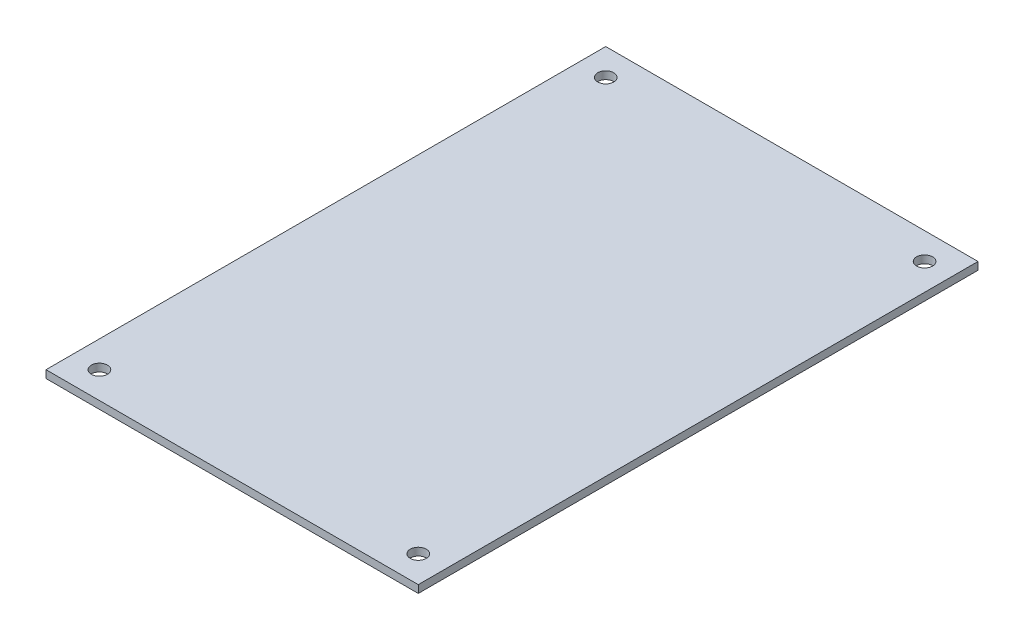
ISO-10303-21;
HEADER;
FILE_DESCRIPTION(('STEP AP214'),'2;1');
FILE_NAME('part.step','',(''),(''),'','','');
FILE_SCHEMA(('AUTOMOTIVE_DESIGN { 1 0 10303 214 1 1 1 1 }'));
ENDSEC;
DATA;
#1=APPLICATION_CONTEXT('core data for automotive mechanical design processes');
#2=APPLICATION_PROTOCOL_DEFINITION('international standard','automotive_design',2000,#1);
#3=PRODUCT_CONTEXT('',#1,'mechanical');
#4=PRODUCT('Part','Part','',(#3));
#5=PRODUCT_RELATED_PRODUCT_CATEGORY('part','',(#4));
#6=PRODUCT_DEFINITION_FORMATION('','',#4);
#7=PRODUCT_DEFINITION_CONTEXT('part definition',#1,'design');
#8=PRODUCT_DEFINITION('design','',#6,#7);
#9=PRODUCT_DEFINITION_SHAPE('','',#8);
#10=(LENGTH_UNIT() NAMED_UNIT(*) SI_UNIT(.MILLI.,.METRE.));
#11=(NAMED_UNIT(*) PLANE_ANGLE_UNIT() SI_UNIT($,.RADIAN.));
#12=(NAMED_UNIT(*) SI_UNIT($,.STERADIAN.) SOLID_ANGLE_UNIT());
#13=UNCERTAINTY_MEASURE_WITH_UNIT(LENGTH_MEASURE(1.E-05),#10,'distance_accuracy_value','');
#14=(GEOMETRIC_REPRESENTATION_CONTEXT(3) GLOBAL_UNCERTAINTY_ASSIGNED_CONTEXT((#13)) GLOBAL_UNIT_ASSIGNED_CONTEXT((#10,
#11,#12)) REPRESENTATION_CONTEXT('',''));
#15=CARTESIAN_POINT('',(0.,0.,0.));
#16=DIRECTION('',(0.,0.,1.));
#17=DIRECTION('',(1.,0.,0.));
#18=AXIS2_PLACEMENT_3D('',#15,#16,#17);
#19=CARTESIAN_POINT('',(-39.4716,1.6256,59.3471));
#20=DIRECTION('',(1.,0.,0.));
#21=DIRECTION('',(0.,0.,-1.));
#22=AXIS2_PLACEMENT_3D('',#19,#20,#21);
#23=PLANE('',#22);
#24=DIRECTION('',(0.,0.,1.));
#25=VECTOR('',#24,1.);
#26=CARTESIAN_POINT('',(-39.4716,0.,59.3471));
#27=LINE('',#26,#25);
#28=CARTESIAN_POINT('',(-39.4716,0.,-59.3471));
#29=VERTEX_POINT('',#28);
#30=CARTESIAN_POINT('',(-39.4716,0.,59.3471));
#31=VERTEX_POINT('',#30);
#32=EDGE_CURVE('E99',#29,#31,#27,.T.);
#33=ORIENTED_EDGE('',*,*,#32,.T.);
#34=DIRECTION('',(0.,-1.,0.));
#35=VECTOR('',#34,1.);
#36=CARTESIAN_POINT('',(-39.4716,1.6256,59.3471));
#37=LINE('',#36,#35);
#38=CARTESIAN_POINT('',(-39.4716,1.6256,59.3471));
#39=VERTEX_POINT('',#38);
#40=EDGE_CURVE('E11',#39,#31,#37,.T.);
#41=ORIENTED_EDGE('',*,*,#40,.F.);
#42=DIRECTION('',(0.,0.,1.));
#43=VECTOR('',#42,1.);
#44=CARTESIAN_POINT('',(-39.4716,1.6256,59.3471));
#45=LINE('',#44,#43);
#46=CARTESIAN_POINT('',(-39.4716,1.6256,-59.3471));
#47=VERTEX_POINT('',#46);
#48=EDGE_CURVE('E87',#47,#39,#45,.T.);
#49=ORIENTED_EDGE('',*,*,#48,.F.);
#50=DIRECTION('',(0.,-1.,0.));
#51=VECTOR('',#50,1.);
#52=CARTESIAN_POINT('',(-39.4716,1.6256,-59.3471));
#53=LINE('',#52,#51);
#54=EDGE_CURVE('E95',#47,#29,#53,.T.);
#55=ORIENTED_EDGE('',*,*,#54,.T.);
#56=EDGE_LOOP('',(#33,#41,#49,#55));
#57=FACE_BOUND('',#56,.T.);
#58=ADVANCED_FACE('F36',(#57),#23,.F.);
#59=CARTESIAN_POINT('',(39.4716,1.6256,59.3471));
#60=DIRECTION('',(0.,0.,-1.));
#61=DIRECTION('',(-1.,0.,0.));
#62=AXIS2_PLACEMENT_3D('',#59,#60,#61);
#63=PLANE('',#62);
#64=DIRECTION('',(1.,0.,0.));
#65=VECTOR('',#64,1.);
#66=CARTESIAN_POINT('',(39.4716,0.,59.3471));
#67=LINE('',#66,#65);
#68=CARTESIAN_POINT('',(39.4716,0.,59.3471));
#69=VERTEX_POINT('',#68);
#70=EDGE_CURVE('E91',#31,#69,#67,.T.);
#71=ORIENTED_EDGE('',*,*,#70,.T.);
#72=DIRECTION('',(0.,-1.,0.));
#73=VECTOR('',#72,1.);
#74=CARTESIAN_POINT('',(39.4716,1.6256,59.3471));
#75=LINE('',#74,#73);
#76=CARTESIAN_POINT('',(39.4716,1.6256,59.3471));
#77=VERTEX_POINT('',#76);
#78=EDGE_CURVE('E44',#77,#69,#75,.T.);
#79=ORIENTED_EDGE('',*,*,#78,.F.);
#80=DIRECTION('',(1.,0.,0.));
#81=VECTOR('',#80,1.);
#82=CARTESIAN_POINT('',(39.4716,1.6256,59.3471));
#83=LINE('',#82,#81);
#84=EDGE_CURVE('E82',#39,#77,#83,.T.);
#85=ORIENTED_EDGE('',*,*,#84,.F.);
#86=ORIENTED_EDGE('',*,*,#40,.T.);
#87=EDGE_LOOP('',(#71,#79,#85,#86));
#88=FACE_BOUND('',#87,.T.);
#89=ADVANCED_FACE('F90',(#88),#63,.F.);
#90=CARTESIAN_POINT('',(39.4716,1.6256,59.3471));
#91=DIRECTION('',(-1.,0.,0.));
#92=DIRECTION('',(0.,0.,1.));
#93=AXIS2_PLACEMENT_3D('',#90,#91,#92);
#94=PLANE('',#93);
#95=DIRECTION('',(0.,0.,-1.));
#96=VECTOR('',#95,1.);
#97=CARTESIAN_POINT('',(39.4716,0.,59.3471));
#98=LINE('',#97,#96);
#99=CARTESIAN_POINT('',(39.4716,0.,-59.3471));
#100=VERTEX_POINT('',#99);
#101=EDGE_CURVE('E69',#69,#100,#98,.T.);
#102=ORIENTED_EDGE('',*,*,#101,.T.);
#103=DIRECTION('',(0.,-1.,0.));
#104=VECTOR('',#103,1.);
#105=CARTESIAN_POINT('',(39.4716,1.6256,-59.3471));
#106=LINE('',#105,#104);
#107=CARTESIAN_POINT('',(39.4716,1.6256,-59.3471));
#108=VERTEX_POINT('',#107);
#109=EDGE_CURVE('E92',#108,#100,#106,.T.);
#110=ORIENTED_EDGE('',*,*,#109,.F.);
#111=DIRECTION('',(0.,0.,-1.));
#112=VECTOR('',#111,1.);
#113=CARTESIAN_POINT('',(39.4716,1.6256,59.3471));
#114=LINE('',#113,#112);
#115=EDGE_CURVE('E85',#77,#108,#114,.T.);
#116=ORIENTED_EDGE('',*,*,#115,.F.);
#117=ORIENTED_EDGE('',*,*,#78,.T.);
#118=EDGE_LOOP('',(#102,#110,#116,#117));
#119=FACE_BOUND('',#118,.T.);
#120=ADVANCED_FACE('F93',(#119),#94,.F.);
#121=CARTESIAN_POINT('',(39.4716,1.6256,-59.3471));
#122=DIRECTION('',(0.,0.,1.));
#123=DIRECTION('',(1.,0.,0.));
#124=AXIS2_PLACEMENT_3D('',#121,#122,#123);
#125=PLANE('',#124);
#126=DIRECTION('',(-1.,0.,0.));
#127=VECTOR('',#126,1.);
#128=CARTESIAN_POINT('',(39.4716,0.,-59.3471));
#129=LINE('',#128,#127);
#130=EDGE_CURVE('E75',#100,#29,#129,.T.);
#131=ORIENTED_EDGE('',*,*,#130,.T.);
#132=ORIENTED_EDGE('',*,*,#54,.F.);
#133=DIRECTION('',(-1.,0.,0.));
#134=VECTOR('',#133,1.);
#135=CARTESIAN_POINT('',(39.4716,1.6256,-59.3471));
#136=LINE('',#135,#134);
#137=EDGE_CURVE('E52',#108,#47,#136,.T.);
#138=ORIENTED_EDGE('',*,*,#137,.F.);
#139=ORIENTED_EDGE('',*,*,#109,.T.);
#140=EDGE_LOOP('',(#131,#132,#138,#139));
#141=FACE_BOUND('',#140,.T.);
#142=ADVANCED_FACE('F107',(#141),#125,.F.);
#143=CARTESIAN_POINT('',(0.,1.6256,0.));
#144=DIRECTION('',(0.,1.,0.));
#145=DIRECTION('',(0.,0.,1.));
#146=AXIS2_PLACEMENT_3D('',#143,#144,#145);
#147=PLANE('',#146);
#148=CARTESIAN_POINT('',(33.8074,1.6256,53.6829));
#149=DIRECTION('',(0.,1.,0.));
#150=DIRECTION('',(0.,0.,-1.));
#151=AXIS2_PLACEMENT_3D('',#148,#149,#150);
#152=CIRCLE('',#151,1.70180000000001);
#153=CARTESIAN_POINT('',(33.8074,1.6256,51.9811));
#154=VERTEX_POINT('',#153);
#155=EDGE_CURVE('E133',#154,#154,#152,.T.);
#156=ORIENTED_EDGE('',*,*,#155,.F.);
#157=EDGE_LOOP('',(#156));
#158=FACE_BOUND('',#157,.T.);
#159=CARTESIAN_POINT('',(-33.8074,1.6256,53.6829));
#160=DIRECTION('',(0.,-1.,0.));
#161=DIRECTION('',(0.,0.,-1.));
#162=AXIS2_PLACEMENT_3D('',#159,#160,#161);
#163=CIRCLE('',#162,1.70180000000001);
#164=CARTESIAN_POINT('',(-33.8074,1.6256,51.9811));
#165=VERTEX_POINT('',#164);
#166=EDGE_CURVE('E122',#165,#165,#163,.T.);
#167=ORIENTED_EDGE('',*,*,#166,.T.);
#168=EDGE_LOOP('',(#167));
#169=FACE_BOUND('',#168,.T.);
#170=CARTESIAN_POINT('',(33.8074,1.6256,-53.6829));
#171=DIRECTION('',(0.,-1.,0.));
#172=DIRECTION('',(0.,0.,1.));
#173=AXIS2_PLACEMENT_3D('',#170,#171,#172);
#174=CIRCLE('',#173,1.70180000000001);
#175=CARTESIAN_POINT('',(33.8074,1.6256,-51.9811));
#176=VERTEX_POINT('',#175);
#177=EDGE_CURVE('E118',#176,#176,#174,.T.);
#178=ORIENTED_EDGE('',*,*,#177,.T.);
#179=EDGE_LOOP('',(#178));
#180=FACE_BOUND('',#179,.T.);
#181=CARTESIAN_POINT('',(-33.8074,1.6256,-53.6829));
#182=DIRECTION('',(0.,1.,0.));
#183=DIRECTION('',(0.,0.,1.));
#184=AXIS2_PLACEMENT_3D('',#181,#182,#183);
#185=CIRCLE('',#184,1.70180000000001);
#186=CARTESIAN_POINT('',(-33.8074,1.6256,-51.9811));
#187=VERTEX_POINT('',#186);
#188=EDGE_CURVE('E115',#187,#187,#185,.T.);
#189=ORIENTED_EDGE('',*,*,#188,.F.);
#190=EDGE_LOOP('',(#189));
#191=FACE_BOUND('',#190,.T.);
#192=ORIENTED_EDGE('',*,*,#48,.T.);
#193=ORIENTED_EDGE('',*,*,#84,.T.);
#194=ORIENTED_EDGE('',*,*,#115,.T.);
#195=ORIENTED_EDGE('',*,*,#137,.T.);
#196=EDGE_LOOP('',(#192,#193,#194,#195));
#197=FACE_BOUND('',#196,.T.);
#198=ADVANCED_FACE('F83',(#158,#169,#180,#191,#197),#147,.T.);
#199=CARTESIAN_POINT('',(0.,0.,0.));
#200=DIRECTION('',(0.,1.,0.));
#201=DIRECTION('',(0.,0.,1.));
#202=AXIS2_PLACEMENT_3D('',#199,#200,#201);
#203=PLANE('',#202);
#204=CARTESIAN_POINT('',(33.8074,0.,53.6829));
#205=DIRECTION('',(0.,1.,0.));
#206=DIRECTION('',(0.,0.,1.));
#207=AXIS2_PLACEMENT_3D('',#204,#205,#206);
#208=CIRCLE('',#207,1.70180000000001);
#209=CARTESIAN_POINT('',(33.8074,0.,55.3847));
#210=VERTEX_POINT('',#209);
#211=EDGE_CURVE('E128',#210,#210,#208,.F.);
#212=ORIENTED_EDGE('',*,*,#211,.F.);
#213=EDGE_LOOP('',(#212));
#214=FACE_BOUND('',#213,.T.);
#215=CARTESIAN_POINT('',(-33.8074,0.,53.6829));
#216=DIRECTION('',(0.,1.,0.));
#217=DIRECTION('',(0.,0.,1.));
#218=AXIS2_PLACEMENT_3D('',#215,#216,#217);
#219=CIRCLE('',#218,1.70180000000001);
#220=CARTESIAN_POINT('',(-33.8074,0.,55.3847));
#221=VERTEX_POINT('',#220);
#222=EDGE_CURVE('E125',#221,#221,#219,.T.);
#223=ORIENTED_EDGE('',*,*,#222,.T.);
#224=EDGE_LOOP('',(#223));
#225=FACE_BOUND('',#224,.T.);
#226=CARTESIAN_POINT('',(33.8074,0.,-53.6829));
#227=DIRECTION('',(0.,1.,0.));
#228=DIRECTION('',(0.,0.,1.));
#229=AXIS2_PLACEMENT_3D('',#226,#227,#228);
#230=CIRCLE('',#229,1.70180000000001);
#231=CARTESIAN_POINT('',(33.8074,0.,-51.9811));
#232=VERTEX_POINT('',#231);
#233=EDGE_CURVE('E119',#232,#232,#230,.T.);
#234=ORIENTED_EDGE('',*,*,#233,.T.);
#235=EDGE_LOOP('',(#234));
#236=FACE_BOUND('',#235,.T.);
#237=CARTESIAN_POINT('',(-33.8074,0.,-53.6829));
#238=DIRECTION('',(0.,1.,0.));
#239=DIRECTION('',(0.,0.,1.));
#240=AXIS2_PLACEMENT_3D('',#237,#238,#239);
#241=CIRCLE('',#240,1.70180000000001);
#242=CARTESIAN_POINT('',(-33.8074,0.,-51.9811));
#243=VERTEX_POINT('',#242);
#244=EDGE_CURVE('E102',#243,#243,#241,.F.);
#245=ORIENTED_EDGE('',*,*,#244,.F.);
#246=EDGE_LOOP('',(#245));
#247=FACE_BOUND('',#246,.T.);
#248=ORIENTED_EDGE('',*,*,#32,.F.);
#249=ORIENTED_EDGE('',*,*,#130,.F.);
#250=ORIENTED_EDGE('',*,*,#101,.F.);
#251=ORIENTED_EDGE('',*,*,#70,.F.);
#252=EDGE_LOOP('',(#248,#249,#250,#251));
#253=FACE_BOUND('',#252,.T.);
#254=ADVANCED_FACE('F110',(#214,#225,#236,#247,#253),#203,.F.);
#255=CARTESIAN_POINT('',(-33.8074,-0.000999999999999916,-53.6829));
#256=DIRECTION('',(0.,1.,0.));
#257=DIRECTION('',(0.,0.,1.));
#258=AXIS2_PLACEMENT_3D('',#255,#256,#257);
#259=CYLINDRICAL_SURFACE('',#258,1.70180000000001);
#260=ORIENTED_EDGE('',*,*,#188,.T.);
#261=EDGE_LOOP('',(#260));
#262=FACE_BOUND('',#261,.T.);
#263=ORIENTED_EDGE('',*,*,#244,.T.);
#264=EDGE_LOOP('',(#263));
#265=FACE_BOUND('',#264,.T.);
#266=ADVANCED_FACE('F149',(#262,#265),#259,.F.);
#267=CARTESIAN_POINT('',(33.8074,-0.000999999999999916,-53.6829));
#268=DIRECTION('',(0.,1.,0.));
#269=DIRECTION('',(0.,0.,1.));
#270=AXIS2_PLACEMENT_3D('',#267,#268,#269);
#271=CYLINDRICAL_SURFACE('',#270,1.70180000000001);
#272=ORIENTED_EDGE('',*,*,#177,.F.);
#273=EDGE_LOOP('',(#272));
#274=FACE_BOUND('',#273,.T.);
#275=ORIENTED_EDGE('',*,*,#233,.F.);
#276=EDGE_LOOP('',(#275));
#277=FACE_BOUND('',#276,.T.);
#278=ADVANCED_FACE('F152',(#274,#277),#271,.F.);
#279=CARTESIAN_POINT('',(-33.8074,-0.000999999999999916,53.6829));
#280=DIRECTION('',(0.,1.,0.));
#281=DIRECTION('',(0.,0.,1.));
#282=AXIS2_PLACEMENT_3D('',#279,#280,#281);
#283=CYLINDRICAL_SURFACE('',#282,1.70180000000001);
#284=ORIENTED_EDGE('',*,*,#166,.F.);
#285=EDGE_LOOP('',(#284));
#286=FACE_BOUND('',#285,.T.);
#287=ORIENTED_EDGE('',*,*,#222,.F.);
#288=EDGE_LOOP('',(#287));
#289=FACE_BOUND('',#288,.T.);
#290=ADVANCED_FACE('F196',(#286,#289),#283,.F.);
#291=CARTESIAN_POINT('',(33.8074,-0.000999999999999916,53.6829));
#292=DIRECTION('',(0.,1.,0.));
#293=DIRECTION('',(0.,0.,1.));
#294=AXIS2_PLACEMENT_3D('',#291,#292,#293);
#295=CYLINDRICAL_SURFACE('',#294,1.70180000000001);
#296=ORIENTED_EDGE('',*,*,#155,.T.);
#297=EDGE_LOOP('',(#296));
#298=FACE_BOUND('',#297,.T.);
#299=ORIENTED_EDGE('',*,*,#211,.T.);
#300=EDGE_LOOP('',(#299));
#301=FACE_BOUND('',#300,.T.);
#302=ADVANCED_FACE('F137',(#298,#301),#295,.F.);
#303=CLOSED_SHELL('',(#58,#89,#120,#142,#198,#254,#266,#278,#290,#302));
#304=MANIFOLD_SOLID_BREP('B2',#303);
#305=ADVANCED_BREP_SHAPE_REPRESENTATION('',(#18,#304),#14);
#306=SHAPE_DEFINITION_REPRESENTATION(#9,#305);
ENDSEC;
END-ISO-10303-21;
